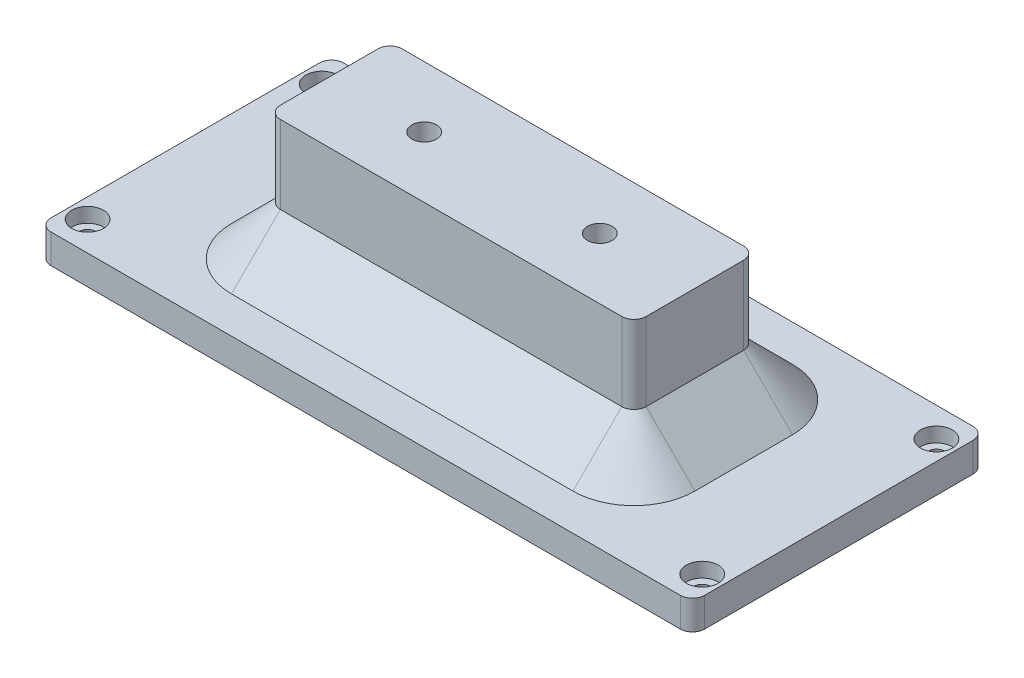
ISO-10303-21;
HEADER;
FILE_DESCRIPTION(('STEP AP214'),'2;1');
FILE_NAME('part.step','',(''),(''),'','','');
FILE_SCHEMA(('AUTOMOTIVE_DESIGN { 1 0 10303 214 1 1 1 1 }'));
ENDSEC;
DATA;
#1=APPLICATION_CONTEXT('core data for automotive mechanical design processes');
#2=APPLICATION_PROTOCOL_DEFINITION('international standard','automotive_design',2000,#1);
#3=PRODUCT_CONTEXT('',#1,'mechanical');
#4=PRODUCT('Part','Part','',(#3));
#5=PRODUCT_RELATED_PRODUCT_CATEGORY('part','',(#4));
#6=PRODUCT_DEFINITION_FORMATION('','',#4);
#7=PRODUCT_DEFINITION_CONTEXT('part definition',#1,'design');
#8=PRODUCT_DEFINITION('design','',#6,#7);
#9=PRODUCT_DEFINITION_SHAPE('','',#8);
#10=(LENGTH_UNIT() NAMED_UNIT(*) SI_UNIT(.MILLI.,.METRE.));
#11=(NAMED_UNIT(*) PLANE_ANGLE_UNIT() SI_UNIT($,.RADIAN.));
#12=(NAMED_UNIT(*) SI_UNIT($,.STERADIAN.) SOLID_ANGLE_UNIT());
#13=UNCERTAINTY_MEASURE_WITH_UNIT(LENGTH_MEASURE(1.E-05),#10,'distance_accuracy_value','');
#14=(GEOMETRIC_REPRESENTATION_CONTEXT(3) GLOBAL_UNCERTAINTY_ASSIGNED_CONTEXT((#13)) GLOBAL_UNIT_ASSIGNED_CONTEXT((#10,
#11,#12)) REPRESENTATION_CONTEXT('',''));
#15=CARTESIAN_POINT('',(0.,0.,0.));
#16=DIRECTION('',(0.,0.,1.));
#17=DIRECTION('',(1.,0.,0.));
#18=AXIS2_PLACEMENT_3D('',#15,#16,#17);
#19=CARTESIAN_POINT('',(0.,6.,0.));
#20=DIRECTION('',(0.,1.,0.));
#21=DIRECTION('',(0.,0.,1.));
#22=AXIS2_PLACEMENT_3D('',#19,#20,#21);
#23=PLANE('',#22);
#24=CARTESIAN_POINT('',(-35.,6.,-10.));
#25=DIRECTION('',(0.,1.,0.));
#26=DIRECTION('',(0.,0.,1.));
#27=AXIS2_PLACEMENT_3D('',#24,#25,#26);
#28=CIRCLE('',#27,12.5);
#29=CARTESIAN_POINT('',(-47.4999999999999,6.,-10.));
#30=VERTEX_POINT('',#29);
#31=CARTESIAN_POINT('',(-35.,6.,-22.5));
#32=VERTEX_POINT('',#31);
#33=EDGE_CURVE('E306',#30,#32,#28,.F.);
#34=ORIENTED_EDGE('',*,*,#33,.T.);
#35=DIRECTION('',(1.,0.,0.));
#36=VECTOR('',#35,1.);
#37=CARTESIAN_POINT('',(0.,6.,-22.5));
#38=LINE('',#37,#36);
#39=CARTESIAN_POINT('',(35.,6.,-22.5));
#40=VERTEX_POINT('',#39);
#41=EDGE_CURVE('E308',#32,#40,#38,.T.);
#42=ORIENTED_EDGE('',*,*,#41,.T.);
#43=CARTESIAN_POINT('',(35.,6.,-10.));
#44=DIRECTION('',(0.,1.,0.));
#45=DIRECTION('',(0.,0.,1.));
#46=AXIS2_PLACEMENT_3D('',#43,#44,#45);
#47=CIRCLE('',#46,12.5);
#48=CARTESIAN_POINT('',(47.5,6.,-10.));
#49=VERTEX_POINT('',#48);
#50=EDGE_CURVE('E304',#40,#49,#47,.F.);
#51=ORIENTED_EDGE('',*,*,#50,.T.);
#52=DIRECTION('',(0.,0.,1.));
#53=VECTOR('',#52,1.);
#54=CARTESIAN_POINT('',(47.5,6.,0.));
#55=LINE('',#54,#53);
#56=CARTESIAN_POINT('',(47.5,6.,10.));
#57=VERTEX_POINT('',#56);
#58=EDGE_CURVE('E299',#49,#57,#55,.T.);
#59=ORIENTED_EDGE('',*,*,#58,.T.);
#60=CARTESIAN_POINT('',(35.,6.,10.));
#61=DIRECTION('',(0.,1.,0.));
#62=DIRECTION('',(0.,0.,1.));
#63=AXIS2_PLACEMENT_3D('',#60,#61,#62);
#64=CIRCLE('',#63,12.5);
#65=CARTESIAN_POINT('',(35.,6.,22.5));
#66=VERTEX_POINT('',#65);
#67=EDGE_CURVE('E295',#57,#66,#64,.F.);
#68=ORIENTED_EDGE('',*,*,#67,.T.);
#69=DIRECTION('',(-1.,0.,0.));
#70=VECTOR('',#69,1.);
#71=CARTESIAN_POINT('',(0.,6.,22.5));
#72=LINE('',#71,#70);
#73=CARTESIAN_POINT('',(-35.,6.,22.5));
#74=VERTEX_POINT('',#73);
#75=EDGE_CURVE('E293',#66,#74,#72,.T.);
#76=ORIENTED_EDGE('',*,*,#75,.T.);
#77=CARTESIAN_POINT('',(-35.,6.,10.));
#78=DIRECTION('',(0.,1.,0.));
#79=DIRECTION('',(0.,0.,1.));
#80=AXIS2_PLACEMENT_3D('',#77,#78,#79);
#81=CIRCLE('',#80,12.5);
#82=CARTESIAN_POINT('',(-47.5,6.,10.));
#83=VERTEX_POINT('',#82);
#84=EDGE_CURVE('E297',#74,#83,#81,.F.);
#85=ORIENTED_EDGE('',*,*,#84,.T.);
#86=DIRECTION('',(0.,0.,-1.));
#87=VECTOR('',#86,1.);
#88=CARTESIAN_POINT('',(-47.4999999999999,6.,0.));
#89=LINE('',#88,#87);
#90=EDGE_CURVE('E301',#83,#30,#89,.T.);
#91=ORIENTED_EDGE('',*,*,#90,.T.);
#92=EDGE_LOOP('',(#34,#42,#51,#59,#68,#76,#85,#91));
#93=FACE_BOUND('',#92,.T.);
#94=CARTESIAN_POINT('',(-63.,6.,-24.));
#95=DIRECTION('',(0.,1.,0.));
#96=DIRECTION('',(0.,0.,1.));
#97=AXIS2_PLACEMENT_3D('',#94,#95,#96);
#98=CIRCLE('',#97,3.25);
#99=CARTESIAN_POINT('',(-63.,6.,-20.75));
#100=VERTEX_POINT('',#99);
#101=EDGE_CURVE('E373',#100,#100,#98,.T.);
#102=ORIENTED_EDGE('',*,*,#101,.F.);
#103=EDGE_LOOP('',(#102));
#104=FACE_BOUND('',#103,.T.);
#105=CARTESIAN_POINT('',(-63.,6.,24.));
#106=DIRECTION('',(0.,1.,0.));
#107=DIRECTION('',(0.,0.,1.));
#108=AXIS2_PLACEMENT_3D('',#105,#106,#107);
#109=CIRCLE('',#108,3.25);
#110=CARTESIAN_POINT('',(-63.,6.,27.25));
#111=VERTEX_POINT('',#110);
#112=EDGE_CURVE('E234',#111,#111,#109,.T.);
#113=ORIENTED_EDGE('',*,*,#112,.F.);
#114=EDGE_LOOP('',(#113));
#115=FACE_BOUND('',#114,.T.);
#116=CARTESIAN_POINT('',(63.,6.,24.));
#117=DIRECTION('',(0.,1.,0.));
#118=DIRECTION('',(0.,0.,1.));
#119=AXIS2_PLACEMENT_3D('',#116,#117,#118);
#120=CIRCLE('',#119,3.25);
#121=CARTESIAN_POINT('',(63.,6.,27.25));
#122=VERTEX_POINT('',#121);
#123=EDGE_CURVE('E229',#122,#122,#120,.T.);
#124=ORIENTED_EDGE('',*,*,#123,.F.);
#125=EDGE_LOOP('',(#124));
#126=FACE_BOUND('',#125,.T.);
#127=CARTESIAN_POINT('',(63.,6.,-24.));
#128=DIRECTION('',(0.,1.,0.));
#129=DIRECTION('',(0.,0.,1.));
#130=AXIS2_PLACEMENT_3D('',#127,#128,#129);
#131=CIRCLE('',#130,3.25);
#132=CARTESIAN_POINT('',(63.,6.,-20.75));
#133=VERTEX_POINT('',#132);
#134=EDGE_CURVE('E224',#133,#133,#131,.T.);
#135=ORIENTED_EDGE('',*,*,#134,.F.);
#136=EDGE_LOOP('',(#135));
#137=FACE_BOUND('',#136,.T.);
#138=DIRECTION('',(0.,0.,-1.));
#139=VECTOR('',#138,1.);
#140=CARTESIAN_POINT('',(67.,6.,-30.));
#141=LINE('',#140,#139);
#142=CARTESIAN_POINT('',(67.,6.,27.5));
#143=VERTEX_POINT('',#142);
#144=CARTESIAN_POINT('',(67.,6.,-27.5));
#145=VERTEX_POINT('',#144);
#146=EDGE_CURVE('E217',#143,#145,#141,.T.);
#147=ORIENTED_EDGE('',*,*,#146,.T.);
#148=CARTESIAN_POINT('',(64.5,6.,-27.5));
#149=DIRECTION('',(0.,1.,0.));
#150=DIRECTION('',(0.,0.,1.));
#151=AXIS2_PLACEMENT_3D('',#148,#149,#150);
#152=CIRCLE('',#151,2.5);
#153=CARTESIAN_POINT('',(64.5,6.,-30.));
#154=VERTEX_POINT('',#153);
#155=EDGE_CURVE('E251',#145,#154,#152,.T.);
#156=ORIENTED_EDGE('',*,*,#155,.T.);
#157=DIRECTION('',(-1.,0.,0.));
#158=VECTOR('',#157,1.);
#159=CARTESIAN_POINT('',(-67.,6.,-30.));
#160=LINE('',#159,#158);
#161=CARTESIAN_POINT('',(-64.5,6.,-30.));
#162=VERTEX_POINT('',#161);
#163=EDGE_CURVE('E199',#154,#162,#160,.T.);
#164=ORIENTED_EDGE('',*,*,#163,.T.);
#165=CARTESIAN_POINT('',(-64.5,6.,-27.5));
#166=DIRECTION('',(0.,1.,0.));
#167=DIRECTION('',(0.,0.,1.));
#168=AXIS2_PLACEMENT_3D('',#165,#166,#167);
#169=CIRCLE('',#168,2.5);
#170=CARTESIAN_POINT('',(-67.,6.,-27.5));
#171=VERTEX_POINT('',#170);
#172=EDGE_CURVE('E245',#162,#171,#169,.T.);
#173=ORIENTED_EDGE('',*,*,#172,.T.);
#174=DIRECTION('',(0.,0.,1.));
#175=VECTOR('',#174,1.);
#176=CARTESIAN_POINT('',(-67.,6.,-30.));
#177=LINE('',#176,#175);
#178=CARTESIAN_POINT('',(-67.,6.,27.5));
#179=VERTEX_POINT('',#178);
#180=EDGE_CURVE('E405',#171,#179,#177,.T.);
#181=ORIENTED_EDGE('',*,*,#180,.T.);
#182=CARTESIAN_POINT('',(-64.5,6.,27.5));
#183=DIRECTION('',(0.,1.,0.));
#184=DIRECTION('',(0.,0.,1.));
#185=AXIS2_PLACEMENT_3D('',#182,#183,#184);
#186=CIRCLE('',#185,2.5);
#187=CARTESIAN_POINT('',(-64.5,6.,30.));
#188=VERTEX_POINT('',#187);
#189=EDGE_CURVE('E247',#179,#188,#186,.T.);
#190=ORIENTED_EDGE('',*,*,#189,.T.);
#191=DIRECTION('',(1.,0.,0.));
#192=VECTOR('',#191,1.);
#193=CARTESIAN_POINT('',(-67.,6.,30.));
#194=LINE('',#193,#192);
#195=CARTESIAN_POINT('',(64.5,6.,30.));
#196=VERTEX_POINT('',#195);
#197=EDGE_CURVE('E236',#188,#196,#194,.T.);
#198=ORIENTED_EDGE('',*,*,#197,.T.);
#199=CARTESIAN_POINT('',(64.5,6.,27.5));
#200=DIRECTION('',(0.,1.,0.));
#201=DIRECTION('',(0.,0.,1.));
#202=AXIS2_PLACEMENT_3D('',#199,#200,#201);
#203=CIRCLE('',#202,2.5);
#204=EDGE_CURVE('E249',#196,#143,#203,.T.);
#205=ORIENTED_EDGE('',*,*,#204,.T.);
#206=EDGE_LOOP('',(#147,#156,#164,#173,#181,#190,#198,#205));
#207=FACE_BOUND('',#206,.T.);
#208=ADVANCED_FACE('F39',(#93,#104,#115,#126,#137,#207),#23,.T.);
#209=CARTESIAN_POINT('',(67.,6.,-30.));
#210=DIRECTION('',(-1.,0.,0.));
#211=DIRECTION('',(0.,0.,1.));
#212=AXIS2_PLACEMENT_3D('',#209,#210,#211);
#213=PLANE('',#212);
#214=DIRECTION('',(0.,0.,-1.));
#215=VECTOR('',#214,1.);
#216=CARTESIAN_POINT('',(67.,0.,-30.));
#217=LINE('',#216,#215);
#218=CARTESIAN_POINT('',(67.,0.,27.5));
#219=VERTEX_POINT('',#218);
#220=CARTESIAN_POINT('',(67.,0.,-27.5));
#221=VERTEX_POINT('',#220);
#222=EDGE_CURVE('E206',#219,#221,#217,.T.);
#223=ORIENTED_EDGE('',*,*,#222,.T.);
#224=DIRECTION('',(0.,-1.,0.));
#225=VECTOR('',#224,1.);
#226=CARTESIAN_POINT('',(67.,6.,-27.5));
#227=LINE('',#226,#225);
#228=EDGE_CURVE('E184',#221,#145,#227,.F.);
#229=ORIENTED_EDGE('',*,*,#228,.T.);
#230=ORIENTED_EDGE('',*,*,#146,.F.);
#231=DIRECTION('',(0.,-1.,0.));
#232=VECTOR('',#231,1.);
#233=CARTESIAN_POINT('',(67.,6.,27.5));
#234=LINE('',#233,#232);
#235=EDGE_CURVE('E189',#143,#219,#234,.T.);
#236=ORIENTED_EDGE('',*,*,#235,.T.);
#237=EDGE_LOOP('',(#223,#229,#230,#236));
#238=FACE_BOUND('',#237,.T.);
#239=ADVANCED_FACE('F420',(#238),#213,.F.);
#240=CARTESIAN_POINT('',(-67.,6.,-30.));
#241=DIRECTION('',(0.,0.,1.));
#242=DIRECTION('',(1.,0.,0.));
#243=AXIS2_PLACEMENT_3D('',#240,#241,#242);
#244=PLANE('',#243);
#245=ORIENTED_EDGE('',*,*,#163,.F.);
#246=DIRECTION('',(0.,-1.,0.));
#247=VECTOR('',#246,1.);
#248=CARTESIAN_POINT('',(64.5,6.,-30.));
#249=LINE('',#248,#247);
#250=CARTESIAN_POINT('',(64.5,0.,-30.));
#251=VERTEX_POINT('',#250);
#252=EDGE_CURVE('E183',#154,#251,#249,.T.);
#253=ORIENTED_EDGE('',*,*,#252,.T.);
#254=DIRECTION('',(-1.,0.,0.));
#255=VECTOR('',#254,1.);
#256=CARTESIAN_POINT('',(-67.,0.,-30.));
#257=LINE('',#256,#255);
#258=CARTESIAN_POINT('',(-64.5,0.,-30.));
#259=VERTEX_POINT('',#258);
#260=EDGE_CURVE('E196',#251,#259,#257,.T.);
#261=ORIENTED_EDGE('',*,*,#260,.T.);
#262=DIRECTION('',(0.,-1.,0.));
#263=VECTOR('',#262,1.);
#264=CARTESIAN_POINT('',(-64.5,6.,-30.));
#265=LINE('',#264,#263);
#266=EDGE_CURVE('E201',#259,#162,#265,.F.);
#267=ORIENTED_EDGE('',*,*,#266,.T.);
#268=EDGE_LOOP('',(#245,#253,#261,#267));
#269=FACE_BOUND('',#268,.T.);
#270=ADVANCED_FACE('F195',(#269),#244,.F.);
#271=CARTESIAN_POINT('',(-67.,6.,-30.));
#272=DIRECTION('',(1.,0.,0.));
#273=DIRECTION('',(0.,0.,-1.));
#274=AXIS2_PLACEMENT_3D('',#271,#272,#273);
#275=PLANE('',#274);
#276=DIRECTION('',(0.,0.,1.));
#277=VECTOR('',#276,1.);
#278=CARTESIAN_POINT('',(-67.,0.,-30.));
#279=LINE('',#278,#277);
#280=CARTESIAN_POINT('',(-67.,0.,-27.5));
#281=VERTEX_POINT('',#280);
#282=CARTESIAN_POINT('',(-67.,0.,27.5));
#283=VERTEX_POINT('',#282);
#284=EDGE_CURVE('E205',#281,#283,#279,.T.);
#285=ORIENTED_EDGE('',*,*,#284,.T.);
#286=DIRECTION('',(0.,-1.,0.));
#287=VECTOR('',#286,1.);
#288=CARTESIAN_POINT('',(-67.,6.,27.5));
#289=LINE('',#288,#287);
#290=EDGE_CURVE('E261',#283,#179,#289,.F.);
#291=ORIENTED_EDGE('',*,*,#290,.T.);
#292=ORIENTED_EDGE('',*,*,#180,.F.);
#293=DIRECTION('',(0.,-1.,0.));
#294=VECTOR('',#293,1.);
#295=CARTESIAN_POINT('',(-67.,6.,-27.5));
#296=LINE('',#295,#294);
#297=EDGE_CURVE('E258',#171,#281,#296,.T.);
#298=ORIENTED_EDGE('',*,*,#297,.T.);
#299=EDGE_LOOP('',(#285,#291,#292,#298));
#300=FACE_BOUND('',#299,.T.);
#301=ADVANCED_FACE('F427',(#300),#275,.F.);
#302=CARTESIAN_POINT('',(-67.,6.,30.));
#303=DIRECTION('',(0.,0.,-1.));
#304=DIRECTION('',(-1.,0.,0.));
#305=AXIS2_PLACEMENT_3D('',#302,#303,#304);
#306=PLANE('',#305);
#307=DIRECTION('',(1.,0.,0.));
#308=VECTOR('',#307,1.);
#309=CARTESIAN_POINT('',(-67.,0.,30.));
#310=LINE('',#309,#308);
#311=CARTESIAN_POINT('',(-64.5,0.,30.));
#312=VERTEX_POINT('',#311);
#313=CARTESIAN_POINT('',(64.5,0.,30.));
#314=VERTEX_POINT('',#313);
#315=EDGE_CURVE('E209',#312,#314,#310,.T.);
#316=ORIENTED_EDGE('',*,*,#315,.T.);
#317=DIRECTION('',(0.,-1.,0.));
#318=VECTOR('',#317,1.);
#319=CARTESIAN_POINT('',(64.5,6.,30.));
#320=LINE('',#319,#318);
#321=EDGE_CURVE('E256',#314,#196,#320,.F.);
#322=ORIENTED_EDGE('',*,*,#321,.T.);
#323=ORIENTED_EDGE('',*,*,#197,.F.);
#324=DIRECTION('',(0.,-1.,0.));
#325=VECTOR('',#324,1.);
#326=CARTESIAN_POINT('',(-64.5,6.,30.));
#327=LINE('',#326,#325);
#328=EDGE_CURVE('E253',#188,#312,#327,.T.);
#329=ORIENTED_EDGE('',*,*,#328,.T.);
#330=EDGE_LOOP('',(#316,#322,#323,#329));
#331=FACE_BOUND('',#330,.T.);
#332=ADVANCED_FACE('F422',(#331),#306,.F.);
#333=CARTESIAN_POINT('',(0.,0.,0.));
#334=DIRECTION('',(0.,1.,0.));
#335=DIRECTION('',(0.,0.,1.));
#336=AXIS2_PLACEMENT_3D('',#333,#334,#335);
#337=PLANE('',#336);
#338=CARTESIAN_POINT('',(-18.,0.,0.));
#339=DIRECTION('',(0.,1.,0.));
#340=DIRECTION('',(0.,0.,1.));
#341=AXIS2_PLACEMENT_3D('',#338,#339,#340);
#342=CIRCLE('',#341,2.52729999999999);
#343=CARTESIAN_POINT('',(-18.,0.,2.5273));
#344=VERTEX_POINT('',#343);
#345=EDGE_CURVE('E348',#344,#344,#342,.T.);
#346=ORIENTED_EDGE('',*,*,#345,.T.);
#347=EDGE_LOOP('',(#346));
#348=FACE_BOUND('',#347,.T.);
#349=CARTESIAN_POINT('',(18.,0.,0.));
#350=DIRECTION('',(0.,1.,0.));
#351=DIRECTION('',(0.,0.,1.));
#352=AXIS2_PLACEMENT_3D('',#349,#350,#351);
#353=CIRCLE('',#352,2.52729999999999);
#354=CARTESIAN_POINT('',(18.,0.,2.52729999999998));
#355=VERTEX_POINT('',#354);
#356=EDGE_CURVE('E358',#355,#355,#353,.T.);
#357=ORIENTED_EDGE('',*,*,#356,.T.);
#358=EDGE_LOOP('',(#357));
#359=FACE_BOUND('',#358,.T.);
#360=CARTESIAN_POINT('',(-63.,0.,-24.));
#361=DIRECTION('',(0.,1.,0.));
#362=DIRECTION('',(0.,0.,1.));
#363=AXIS2_PLACEMENT_3D('',#360,#361,#362);
#364=CIRCLE('',#363,1.7);
#365=CARTESIAN_POINT('',(-63.,0.,-22.3));
#366=VERTEX_POINT('',#365);
#367=EDGE_CURVE('E231',#366,#366,#364,.T.);
#368=ORIENTED_EDGE('',*,*,#367,.T.);
#369=EDGE_LOOP('',(#368));
#370=FACE_BOUND('',#369,.T.);
#371=CARTESIAN_POINT('',(-63.,0.,24.));
#372=DIRECTION('',(0.,1.,0.));
#373=DIRECTION('',(0.,0.,1.));
#374=AXIS2_PLACEMENT_3D('',#371,#372,#373);
#375=CIRCLE('',#374,1.7);
#376=CARTESIAN_POINT('',(-63.,0.,25.7));
#377=VERTEX_POINT('',#376);
#378=EDGE_CURVE('E226',#377,#377,#375,.T.);
#379=ORIENTED_EDGE('',*,*,#378,.T.);
#380=EDGE_LOOP('',(#379));
#381=FACE_BOUND('',#380,.T.);
#382=CARTESIAN_POINT('',(63.,0.,24.));
#383=DIRECTION('',(0.,1.,0.));
#384=DIRECTION('',(0.,0.,1.));
#385=AXIS2_PLACEMENT_3D('',#382,#383,#384);
#386=CIRCLE('',#385,1.69999999999999);
#387=CARTESIAN_POINT('',(63.,0.,25.7));
#388=VERTEX_POINT('',#387);
#389=EDGE_CURVE('E221',#388,#388,#386,.T.);
#390=ORIENTED_EDGE('',*,*,#389,.T.);
#391=EDGE_LOOP('',(#390));
#392=FACE_BOUND('',#391,.T.);
#393=CARTESIAN_POINT('',(63.,0.,-24.));
#394=DIRECTION('',(0.,1.,0.));
#395=DIRECTION('',(0.,0.,1.));
#396=AXIS2_PLACEMENT_3D('',#393,#394,#395);
#397=CIRCLE('',#396,1.69999999999999);
#398=CARTESIAN_POINT('',(63.,0.,-22.3));
#399=VERTEX_POINT('',#398);
#400=EDGE_CURVE('E211',#399,#399,#397,.T.);
#401=ORIENTED_EDGE('',*,*,#400,.T.);
#402=EDGE_LOOP('',(#401));
#403=FACE_BOUND('',#402,.T.);
#404=ORIENTED_EDGE('',*,*,#260,.F.);
#405=CARTESIAN_POINT('',(64.5,0.,-27.5));
#406=DIRECTION('',(0.,1.,0.));
#407=DIRECTION('',(0.,0.,1.));
#408=AXIS2_PLACEMENT_3D('',#405,#406,#407);
#409=CIRCLE('',#408,2.5);
#410=EDGE_CURVE('E179',#251,#221,#409,.F.);
#411=ORIENTED_EDGE('',*,*,#410,.T.);
#412=ORIENTED_EDGE('',*,*,#222,.F.);
#413=CARTESIAN_POINT('',(64.5,0.,27.5));
#414=DIRECTION('',(0.,1.,0.));
#415=DIRECTION('',(0.,0.,1.));
#416=AXIS2_PLACEMENT_3D('',#413,#414,#415);
#417=CIRCLE('',#416,2.5);
#418=EDGE_CURVE('E190',#219,#314,#417,.F.);
#419=ORIENTED_EDGE('',*,*,#418,.T.);
#420=ORIENTED_EDGE('',*,*,#315,.F.);
#421=CARTESIAN_POINT('',(-64.5,0.,27.5));
#422=DIRECTION('',(0.,1.,0.));
#423=DIRECTION('',(0.,0.,1.));
#424=AXIS2_PLACEMENT_3D('',#421,#422,#423);
#425=CIRCLE('',#424,2.5);
#426=EDGE_CURVE('E239',#312,#283,#425,.F.);
#427=ORIENTED_EDGE('',*,*,#426,.T.);
#428=ORIENTED_EDGE('',*,*,#284,.F.);
#429=CARTESIAN_POINT('',(-64.5,0.,-27.5));
#430=DIRECTION('',(0.,1.,0.));
#431=DIRECTION('',(0.,0.,1.));
#432=AXIS2_PLACEMENT_3D('',#429,#430,#431);
#433=CIRCLE('',#432,2.5);
#434=EDGE_CURVE('E200',#281,#259,#433,.F.);
#435=ORIENTED_EDGE('',*,*,#434,.T.);
#436=EDGE_LOOP('',(#404,#411,#412,#419,#420,#427,#428,#435));
#437=FACE_BOUND('',#436,.T.);
#438=ADVANCED_FACE('F203',(#348,#359,#370,#381,#392,#403,#437),#337,.F.);
#439=CARTESIAN_POINT('',(63.,6.,-24.));
#440=DIRECTION('',(0.,1.,0.));
#441=DIRECTION('',(0.,0.,1.));
#442=AXIS2_PLACEMENT_3D('',#439,#440,#441);
#443=CYLINDRICAL_SURFACE('',#442,1.69999999999999);
#444=CARTESIAN_POINT('',(63.,3.,-24.));
#445=DIRECTION('',(0.,1.,0.));
#446=DIRECTION('',(0.,0.,1.));
#447=AXIS2_PLACEMENT_3D('',#444,#445,#446);
#448=CIRCLE('',#447,1.69999999999999);
#449=CARTESIAN_POINT('',(63.,3.,-22.3));
#450=VERTEX_POINT('',#449);
#451=EDGE_CURVE('E220',#450,#450,#448,.T.);
#452=ORIENTED_EDGE('',*,*,#451,.T.);
#453=EDGE_LOOP('',(#452));
#454=FACE_BOUND('',#453,.T.);
#455=ORIENTED_EDGE('',*,*,#400,.F.);
#456=EDGE_LOOP('',(#455));
#457=FACE_BOUND('',#456,.T.);
#458=ADVANCED_FACE('F454',(#454,#457),#443,.F.);
#459=CARTESIAN_POINT('',(64.7,3.,-24.));
#460=DIRECTION('',(0.,-1.,0.));
#461=DIRECTION('',(0.,0.,-1.));
#462=AXIS2_PLACEMENT_3D('',#459,#460,#461);
#463=PLANE('',#462);
#464=ORIENTED_EDGE('',*,*,#451,.F.);
#465=EDGE_LOOP('',(#464));
#466=FACE_BOUND('',#465,.T.);
#467=CARTESIAN_POINT('',(63.,3.,-24.));
#468=DIRECTION('',(0.,1.,0.));
#469=DIRECTION('',(0.,0.,1.));
#470=AXIS2_PLACEMENT_3D('',#467,#468,#469);
#471=CIRCLE('',#470,3.25);
#472=CARTESIAN_POINT('',(63.,3.,-20.75));
#473=VERTEX_POINT('',#472);
#474=EDGE_CURVE('E397',#473,#473,#471,.T.);
#475=ORIENTED_EDGE('',*,*,#474,.T.);
#476=EDGE_LOOP('',(#475));
#477=FACE_BOUND('',#476,.T.);
#478=ADVANCED_FACE('F765',(#466,#477),#463,.F.);
#479=CARTESIAN_POINT('',(63.,6.,-24.));
#480=DIRECTION('',(0.,1.,0.));
#481=DIRECTION('',(0.,0.,1.));
#482=AXIS2_PLACEMENT_3D('',#479,#480,#481);
#483=CYLINDRICAL_SURFACE('',#482,3.25);
#484=ORIENTED_EDGE('',*,*,#474,.F.);
#485=EDGE_LOOP('',(#484));
#486=FACE_BOUND('',#485,.T.);
#487=ORIENTED_EDGE('',*,*,#134,.T.);
#488=EDGE_LOOP('',(#487));
#489=FACE_BOUND('',#488,.T.);
#490=ADVANCED_FACE('F771',(#486,#489),#483,.F.);
#491=CARTESIAN_POINT('',(63.,6.,24.));
#492=DIRECTION('',(0.,1.,0.));
#493=DIRECTION('',(0.,0.,1.));
#494=AXIS2_PLACEMENT_3D('',#491,#492,#493);
#495=CYLINDRICAL_SURFACE('',#494,1.69999999999999);
#496=CARTESIAN_POINT('',(63.,3.,24.));
#497=DIRECTION('',(0.,1.,0.));
#498=DIRECTION('',(0.,0.,1.));
#499=AXIS2_PLACEMENT_3D('',#496,#497,#498);
#500=CIRCLE('',#499,1.69999999999999);
#501=CARTESIAN_POINT('',(63.,3.,25.7));
#502=VERTEX_POINT('',#501);
#503=EDGE_CURVE('E225',#502,#502,#500,.T.);
#504=ORIENTED_EDGE('',*,*,#503,.T.);
#505=EDGE_LOOP('',(#504));
#506=FACE_BOUND('',#505,.T.);
#507=ORIENTED_EDGE('',*,*,#389,.F.);
#508=EDGE_LOOP('',(#507));
#509=FACE_BOUND('',#508,.T.);
#510=ADVANCED_FACE('F778',(#506,#509),#495,.F.);
#511=CARTESIAN_POINT('',(64.7,3.,24.));
#512=DIRECTION('',(0.,-1.,0.));
#513=DIRECTION('',(0.,0.,-1.));
#514=AXIS2_PLACEMENT_3D('',#511,#512,#513);
#515=PLANE('',#514);
#516=ORIENTED_EDGE('',*,*,#503,.F.);
#517=EDGE_LOOP('',(#516));
#518=FACE_BOUND('',#517,.T.);
#519=CARTESIAN_POINT('',(63.,3.,24.));
#520=DIRECTION('',(0.,1.,0.));
#521=DIRECTION('',(0.,0.,1.));
#522=AXIS2_PLACEMENT_3D('',#519,#520,#521);
#523=CIRCLE('',#522,3.25);
#524=CARTESIAN_POINT('',(63.,3.,27.25));
#525=VERTEX_POINT('',#524);
#526=EDGE_CURVE('E390',#525,#525,#523,.T.);
#527=ORIENTED_EDGE('',*,*,#526,.T.);
#528=EDGE_LOOP('',(#527));
#529=FACE_BOUND('',#528,.T.);
#530=ADVANCED_FACE('F786',(#518,#529),#515,.F.);
#531=CARTESIAN_POINT('',(63.,6.,24.));
#532=DIRECTION('',(0.,1.,0.));
#533=DIRECTION('',(0.,0.,1.));
#534=AXIS2_PLACEMENT_3D('',#531,#532,#533);
#535=CYLINDRICAL_SURFACE('',#534,3.25);
#536=ORIENTED_EDGE('',*,*,#526,.F.);
#537=EDGE_LOOP('',(#536));
#538=FACE_BOUND('',#537,.T.);
#539=ORIENTED_EDGE('',*,*,#123,.T.);
#540=EDGE_LOOP('',(#539));
#541=FACE_BOUND('',#540,.T.);
#542=ADVANCED_FACE('F794',(#538,#541),#535,.F.);
#543=CARTESIAN_POINT('',(-63.,6.,24.));
#544=DIRECTION('',(0.,1.,0.));
#545=DIRECTION('',(0.,0.,1.));
#546=AXIS2_PLACEMENT_3D('',#543,#544,#545);
#547=CYLINDRICAL_SURFACE('',#546,1.7);
#548=CARTESIAN_POINT('',(-63.,3.,24.));
#549=DIRECTION('',(0.,1.,0.));
#550=DIRECTION('',(0.,0.,1.));
#551=AXIS2_PLACEMENT_3D('',#548,#549,#550);
#552=CIRCLE('',#551,1.7);
#553=CARTESIAN_POINT('',(-63.,3.,25.7));
#554=VERTEX_POINT('',#553);
#555=EDGE_CURVE('E230',#554,#554,#552,.T.);
#556=ORIENTED_EDGE('',*,*,#555,.T.);
#557=EDGE_LOOP('',(#556));
#558=FACE_BOUND('',#557,.T.);
#559=ORIENTED_EDGE('',*,*,#378,.F.);
#560=EDGE_LOOP('',(#559));
#561=FACE_BOUND('',#560,.T.);
#562=ADVANCED_FACE('F802',(#558,#561),#547,.F.);
#563=CARTESIAN_POINT('',(-61.3,3.,24.));
#564=DIRECTION('',(0.,-1.,0.));
#565=DIRECTION('',(0.,0.,-1.));
#566=AXIS2_PLACEMENT_3D('',#563,#564,#565);
#567=PLANE('',#566);
#568=ORIENTED_EDGE('',*,*,#555,.F.);
#569=EDGE_LOOP('',(#568));
#570=FACE_BOUND('',#569,.T.);
#571=CARTESIAN_POINT('',(-63.,3.,24.));
#572=DIRECTION('',(0.,1.,0.));
#573=DIRECTION('',(0.,0.,1.));
#574=AXIS2_PLACEMENT_3D('',#571,#572,#573);
#575=CIRCLE('',#574,3.25);
#576=CARTESIAN_POINT('',(-63.,3.,27.25));
#577=VERTEX_POINT('',#576);
#578=EDGE_CURVE('E383',#577,#577,#575,.T.);
#579=ORIENTED_EDGE('',*,*,#578,.T.);
#580=EDGE_LOOP('',(#579));
#581=FACE_BOUND('',#580,.T.);
#582=ADVANCED_FACE('F810',(#570,#581),#567,.F.);
#583=CARTESIAN_POINT('',(-63.,6.,24.));
#584=DIRECTION('',(0.,1.,0.));
#585=DIRECTION('',(0.,0.,1.));
#586=AXIS2_PLACEMENT_3D('',#583,#584,#585);
#587=CYLINDRICAL_SURFACE('',#586,3.25);
#588=ORIENTED_EDGE('',*,*,#578,.F.);
#589=EDGE_LOOP('',(#588));
#590=FACE_BOUND('',#589,.T.);
#591=ORIENTED_EDGE('',*,*,#112,.T.);
#592=EDGE_LOOP('',(#591));
#593=FACE_BOUND('',#592,.T.);
#594=ADVANCED_FACE('F818',(#590,#593),#587,.F.);
#595=CARTESIAN_POINT('',(-63.,6.,-24.));
#596=DIRECTION('',(0.,1.,0.));
#597=DIRECTION('',(0.,0.,1.));
#598=AXIS2_PLACEMENT_3D('',#595,#596,#597);
#599=CYLINDRICAL_SURFACE('',#598,1.7);
#600=CARTESIAN_POINT('',(-63.,3.,-24.));
#601=DIRECTION('',(0.,1.,0.));
#602=DIRECTION('',(0.,0.,1.));
#603=AXIS2_PLACEMENT_3D('',#600,#601,#602);
#604=CIRCLE('',#603,1.7);
#605=CARTESIAN_POINT('',(-63.,3.,-22.3));
#606=VERTEX_POINT('',#605);
#607=EDGE_CURVE('E235',#606,#606,#604,.T.);
#608=ORIENTED_EDGE('',*,*,#607,.T.);
#609=EDGE_LOOP('',(#608));
#610=FACE_BOUND('',#609,.T.);
#611=ORIENTED_EDGE('',*,*,#367,.F.);
#612=EDGE_LOOP('',(#611));
#613=FACE_BOUND('',#612,.T.);
#614=ADVANCED_FACE('F826',(#610,#613),#599,.F.);
#615=CARTESIAN_POINT('',(-61.3,3.,-24.));
#616=DIRECTION('',(0.,-1.,0.));
#617=DIRECTION('',(0.,0.,-1.));
#618=AXIS2_PLACEMENT_3D('',#615,#616,#617);
#619=PLANE('',#618);
#620=ORIENTED_EDGE('',*,*,#607,.F.);
#621=EDGE_LOOP('',(#620));
#622=FACE_BOUND('',#621,.T.);
#623=CARTESIAN_POINT('',(-63.,3.,-24.));
#624=DIRECTION('',(0.,1.,0.));
#625=DIRECTION('',(0.,0.,1.));
#626=AXIS2_PLACEMENT_3D('',#623,#624,#625);
#627=CIRCLE('',#626,3.25);
#628=CARTESIAN_POINT('',(-63.,3.,-20.75));
#629=VERTEX_POINT('',#628);
#630=EDGE_CURVE('E376',#629,#629,#627,.T.);
#631=ORIENTED_EDGE('',*,*,#630,.T.);
#632=EDGE_LOOP('',(#631));
#633=FACE_BOUND('',#632,.T.);
#634=ADVANCED_FACE('F834',(#622,#633),#619,.F.);
#635=CARTESIAN_POINT('',(-63.,6.,-24.));
#636=DIRECTION('',(0.,1.,0.));
#637=DIRECTION('',(0.,0.,1.));
#638=AXIS2_PLACEMENT_3D('',#635,#636,#637);
#639=CYLINDRICAL_SURFACE('',#638,3.25);
#640=ORIENTED_EDGE('',*,*,#630,.F.);
#641=EDGE_LOOP('',(#640));
#642=FACE_BOUND('',#641,.T.);
#643=ORIENTED_EDGE('',*,*,#101,.T.);
#644=EDGE_LOOP('',(#643));
#645=FACE_BOUND('',#644,.T.);
#646=ADVANCED_FACE('F519',(#642,#645),#639,.F.);
#647=CARTESIAN_POINT('',(37.5,32.,-12.5));
#648=DIRECTION('',(-1.,0.,0.));
#649=DIRECTION('',(0.,0.,1.));
#650=AXIS2_PLACEMENT_3D('',#647,#648,#649);
#651=PLANE('',#650);
#652=DIRECTION('',(0.,-1.,0.));
#653=VECTOR('',#652,1.);
#654=CARTESIAN_POINT('',(37.5,32.,10.));
#655=LINE('',#654,#653);
#656=CARTESIAN_POINT('',(37.5,32.,10.));
#657=VERTEX_POINT('',#656);
#658=CARTESIAN_POINT('',(37.5,16.0000000000001,10.));
#659=VERTEX_POINT('',#658);
#660=EDGE_CURVE('E268',#657,#659,#655,.T.);
#661=ORIENTED_EDGE('',*,*,#660,.T.);
#662=DIRECTION('',(0.,0.,-1.));
#663=VECTOR('',#662,1.);
#664=CARTESIAN_POINT('',(37.5,16.0000000000001,-12.5));
#665=LINE('',#664,#663);
#666=CARTESIAN_POINT('',(37.5,16.0000000000001,-10.));
#667=VERTEX_POINT('',#666);
#668=EDGE_CURVE('E312',#659,#667,#665,.T.);
#669=ORIENTED_EDGE('',*,*,#668,.T.);
#670=DIRECTION('',(0.,-1.,0.));
#671=VECTOR('',#670,1.);
#672=CARTESIAN_POINT('',(37.5,32.,-10.));
#673=LINE('',#672,#671);
#674=CARTESIAN_POINT('',(37.5,32.,-10.));
#675=VERTEX_POINT('',#674);
#676=EDGE_CURVE('E271',#667,#675,#673,.F.);
#677=ORIENTED_EDGE('',*,*,#676,.T.);
#678=DIRECTION('',(0.,0.,-1.));
#679=VECTOR('',#678,1.);
#680=CARTESIAN_POINT('',(37.5,32.,-12.5));
#681=LINE('',#680,#679);
#682=EDGE_CURVE('E361',#657,#675,#681,.T.);
#683=ORIENTED_EDGE('',*,*,#682,.F.);
#684=EDGE_LOOP('',(#661,#669,#677,#683));
#685=FACE_BOUND('',#684,.T.);
#686=ADVANCED_FACE('F513',(#685),#651,.F.);
#687=CARTESIAN_POINT('',(-37.5,32.,-12.5));
#688=DIRECTION('',(0.,0.,1.));
#689=DIRECTION('',(1.,0.,0.));
#690=AXIS2_PLACEMENT_3D('',#687,#688,#689);
#691=PLANE('',#690);
#692=DIRECTION('',(0.,-1.,0.));
#693=VECTOR('',#692,1.);
#694=CARTESIAN_POINT('',(35.,32.,-12.5));
#695=LINE('',#694,#693);
#696=CARTESIAN_POINT('',(35.,32.,-12.5));
#697=VERTEX_POINT('',#696);
#698=CARTESIAN_POINT('',(35.,16.0000000000001,-12.5));
#699=VERTEX_POINT('',#698);
#700=EDGE_CURVE('E265',#697,#699,#695,.T.);
#701=ORIENTED_EDGE('',*,*,#700,.T.);
#702=DIRECTION('',(-1.,0.,0.));
#703=VECTOR('',#702,1.);
#704=CARTESIAN_POINT('',(-37.5,16.0000000000001,-12.5));
#705=LINE('',#704,#703);
#706=CARTESIAN_POINT('',(-35.,16.0000000000001,-12.5));
#707=VERTEX_POINT('',#706);
#708=EDGE_CURVE('E310',#699,#707,#705,.T.);
#709=ORIENTED_EDGE('',*,*,#708,.T.);
#710=DIRECTION('',(0.,-1.,0.));
#711=VECTOR('',#710,1.);
#712=CARTESIAN_POINT('',(-35.,32.,-12.5));
#713=LINE('',#712,#711);
#714=CARTESIAN_POINT('',(-35.,32.,-12.5));
#715=VERTEX_POINT('',#714);
#716=EDGE_CURVE('E263',#707,#715,#713,.F.);
#717=ORIENTED_EDGE('',*,*,#716,.T.);
#718=DIRECTION('',(-1.,0.,0.));
#719=VECTOR('',#718,1.);
#720=CARTESIAN_POINT('',(-37.5,32.,-12.5));
#721=LINE('',#720,#719);
#722=EDGE_CURVE('E364',#697,#715,#721,.T.);
#723=ORIENTED_EDGE('',*,*,#722,.F.);
#724=EDGE_LOOP('',(#701,#709,#717,#723));
#725=FACE_BOUND('',#724,.T.);
#726=ADVANCED_FACE('F518',(#725),#691,.F.);
#727=CARTESIAN_POINT('',(-37.5,32.,-12.5));
#728=DIRECTION('',(1.,0.,0.));
#729=DIRECTION('',(0.,0.,-1.));
#730=AXIS2_PLACEMENT_3D('',#727,#728,#729);
#731=PLANE('',#730);
#732=DIRECTION('',(0.,-1.,0.));
#733=VECTOR('',#732,1.);
#734=CARTESIAN_POINT('',(-37.5,32.,-10.));
#735=LINE('',#734,#733);
#736=CARTESIAN_POINT('',(-37.5,32.,-10.));
#737=VERTEX_POINT('',#736);
#738=CARTESIAN_POINT('',(-37.5,16.0000000000001,-10.));
#739=VERTEX_POINT('',#738);
#740=EDGE_CURVE('E285',#737,#739,#735,.T.);
#741=ORIENTED_EDGE('',*,*,#740,.T.);
#742=DIRECTION('',(0.,0.,1.));
#743=VECTOR('',#742,1.);
#744=CARTESIAN_POINT('',(-37.5,16.,-12.5));
#745=LINE('',#744,#743);
#746=CARTESIAN_POINT('',(-37.5,16.0000000000001,10.));
#747=VERTEX_POINT('',#746);
#748=EDGE_CURVE('E290',#739,#747,#745,.T.);
#749=ORIENTED_EDGE('',*,*,#748,.T.);
#750=DIRECTION('',(0.,-1.,0.));
#751=VECTOR('',#750,1.);
#752=CARTESIAN_POINT('',(-37.5,32.,10.));
#753=LINE('',#752,#751);
#754=CARTESIAN_POINT('',(-37.5,32.,10.));
#755=VERTEX_POINT('',#754);
#756=EDGE_CURVE('E288',#747,#755,#753,.F.);
#757=ORIENTED_EDGE('',*,*,#756,.T.);
#758=DIRECTION('',(0.,0.,1.));
#759=VECTOR('',#758,1.);
#760=CARTESIAN_POINT('',(-37.5,32.,-12.5));
#761=LINE('',#760,#759);
#762=EDGE_CURVE('E367',#737,#755,#761,.T.);
#763=ORIENTED_EDGE('',*,*,#762,.F.);
#764=EDGE_LOOP('',(#741,#749,#757,#763));
#765=FACE_BOUND('',#764,.T.);
#766=ADVANCED_FACE('F530',(#765),#731,.F.);
#767=CARTESIAN_POINT('',(-37.5,32.,12.5));
#768=DIRECTION('',(0.,0.,-1.));
#769=DIRECTION('',(-1.,0.,0.));
#770=AXIS2_PLACEMENT_3D('',#767,#768,#769);
#771=PLANE('',#770);
#772=DIRECTION('',(0.,-1.,0.));
#773=VECTOR('',#772,1.);
#774=CARTESIAN_POINT('',(-35.,32.,12.5));
#775=LINE('',#774,#773);
#776=CARTESIAN_POINT('',(-35.,32.,12.5));
#777=VERTEX_POINT('',#776);
#778=CARTESIAN_POINT('',(-35.,16.0000000000001,12.5));
#779=VERTEX_POINT('',#778);
#780=EDGE_CURVE('E281',#777,#779,#775,.T.);
#781=ORIENTED_EDGE('',*,*,#780,.T.);
#782=DIRECTION('',(1.,0.,0.));
#783=VECTOR('',#782,1.);
#784=CARTESIAN_POINT('',(-37.5,16.0000000000001,12.5));
#785=LINE('',#784,#783);
#786=CARTESIAN_POINT('',(35.,16.0000000000001,12.5));
#787=VERTEX_POINT('',#786);
#788=EDGE_CURVE('E11',#779,#787,#785,.T.);
#789=ORIENTED_EDGE('',*,*,#788,.T.);
#790=DIRECTION('',(0.,-1.,0.));
#791=VECTOR('',#790,1.);
#792=CARTESIAN_POINT('',(35.,32.,12.5));
#793=LINE('',#792,#791);
#794=CARTESIAN_POINT('',(35.,32.,12.5));
#795=VERTEX_POINT('',#794);
#796=EDGE_CURVE('E283',#787,#795,#793,.F.);
#797=ORIENTED_EDGE('',*,*,#796,.T.);
#798=DIRECTION('',(1.,0.,0.));
#799=VECTOR('',#798,1.);
#800=CARTESIAN_POINT('',(-37.5,32.,12.5));
#801=LINE('',#800,#799);
#802=EDGE_CURVE('E370',#777,#795,#801,.T.);
#803=ORIENTED_EDGE('',*,*,#802,.F.);
#804=EDGE_LOOP('',(#781,#789,#797,#803));
#805=FACE_BOUND('',#804,.T.);
#806=ADVANCED_FACE('F495',(#805),#771,.F.);
#807=CARTESIAN_POINT('',(0.,32.,0.));
#808=DIRECTION('',(0.,1.,0.));
#809=DIRECTION('',(0.,0.,1.));
#810=AXIS2_PLACEMENT_3D('',#807,#808,#809);
#811=PLANE('',#810);
#812=CARTESIAN_POINT('',(-18.,32.,0.));
#813=DIRECTION('',(0.,1.,0.));
#814=DIRECTION('',(0.,0.,1.));
#815=AXIS2_PLACEMENT_3D('',#812,#813,#814);
#816=CIRCLE('',#815,2.52729999999999);
#817=CARTESIAN_POINT('',(-18.,32.,2.52729999999999));
#818=VERTEX_POINT('',#817);
#819=EDGE_CURVE('E342',#818,#818,#816,.T.);
#820=ORIENTED_EDGE('',*,*,#819,.F.);
#821=EDGE_LOOP('',(#820));
#822=FACE_BOUND('',#821,.T.);
#823=CARTESIAN_POINT('',(18.,32.,0.));
#824=DIRECTION('',(0.,1.,0.));
#825=DIRECTION('',(0.,0.,1.));
#826=AXIS2_PLACEMENT_3D('',#823,#824,#825);
#827=CIRCLE('',#826,2.52729999999999);
#828=CARTESIAN_POINT('',(18.,32.,2.52729999999998));
#829=VERTEX_POINT('',#828);
#830=EDGE_CURVE('E353',#829,#829,#827,.T.);
#831=ORIENTED_EDGE('',*,*,#830,.F.);
#832=EDGE_LOOP('',(#831));
#833=FACE_BOUND('',#832,.T.);
#834=ORIENTED_EDGE('',*,*,#682,.T.);
#835=CARTESIAN_POINT('',(35.,32.,-10.));
#836=DIRECTION('',(0.,1.,0.));
#837=DIRECTION('',(0.,0.,1.));
#838=AXIS2_PLACEMENT_3D('',#835,#836,#837);
#839=CIRCLE('',#838,2.5);
#840=EDGE_CURVE('E279',#675,#697,#839,.T.);
#841=ORIENTED_EDGE('',*,*,#840,.T.);
#842=ORIENTED_EDGE('',*,*,#722,.T.);
#843=CARTESIAN_POINT('',(-35.,32.,-10.));
#844=DIRECTION('',(0.,1.,0.));
#845=DIRECTION('',(0.,0.,1.));
#846=AXIS2_PLACEMENT_3D('',#843,#844,#845);
#847=CIRCLE('',#846,2.5);
#848=EDGE_CURVE('E273',#715,#737,#847,.T.);
#849=ORIENTED_EDGE('',*,*,#848,.T.);
#850=ORIENTED_EDGE('',*,*,#762,.T.);
#851=CARTESIAN_POINT('',(-35.,32.,10.));
#852=DIRECTION('',(0.,1.,0.));
#853=DIRECTION('',(0.,0.,1.));
#854=AXIS2_PLACEMENT_3D('',#851,#852,#853);
#855=CIRCLE('',#854,2.5);
#856=EDGE_CURVE('E275',#755,#777,#855,.T.);
#857=ORIENTED_EDGE('',*,*,#856,.T.);
#858=ORIENTED_EDGE('',*,*,#802,.T.);
#859=CARTESIAN_POINT('',(35.,32.,10.));
#860=DIRECTION('',(0.,1.,0.));
#861=DIRECTION('',(0.,0.,1.));
#862=AXIS2_PLACEMENT_3D('',#859,#860,#861);
#863=CIRCLE('',#862,2.5);
#864=EDGE_CURVE('E277',#795,#657,#863,.T.);
#865=ORIENTED_EDGE('',*,*,#864,.T.);
#866=EDGE_LOOP('',(#834,#841,#842,#849,#850,#857,#858,#865));
#867=FACE_BOUND('',#866,.T.);
#868=ADVANCED_FACE('F490',(#822,#833,#867),#811,.T.);
#869=CARTESIAN_POINT('',(18.,32.,0.));
#870=DIRECTION('',(0.,1.,0.));
#871=DIRECTION('',(0.,0.,1.));
#872=AXIS2_PLACEMENT_3D('',#869,#870,#871);
#873=CYLINDRICAL_SURFACE('',#872,2.52729999999999);
#874=ORIENTED_EDGE('',*,*,#356,.F.);
#875=EDGE_LOOP('',(#874));
#876=FACE_BOUND('',#875,.T.);
#877=ORIENTED_EDGE('',*,*,#830,.T.);
#878=EDGE_LOOP('',(#877));
#879=FACE_BOUND('',#878,.T.);
#880=ADVANCED_FACE('F494',(#876,#879),#873,.F.);
#881=CARTESIAN_POINT('',(-18.,32.,0.));
#882=DIRECTION('',(0.,1.,0.));
#883=DIRECTION('',(0.,0.,1.));
#884=AXIS2_PLACEMENT_3D('',#881,#882,#883);
#885=CYLINDRICAL_SURFACE('',#884,2.52729999999999);
#886=ORIENTED_EDGE('',*,*,#345,.F.);
#887=EDGE_LOOP('',(#886));
#888=FACE_BOUND('',#887,.T.);
#889=ORIENTED_EDGE('',*,*,#819,.T.);
#890=EDGE_LOOP('',(#889));
#891=FACE_BOUND('',#890,.T.);
#892=ADVANCED_FACE('F467',(#888,#891),#885,.F.);
#893=CARTESIAN_POINT('',(64.5,6.,-27.5));
#894=DIRECTION('',(0.,-1.,0.));
#895=DIRECTION('',(0.,0.,-1.));
#896=AXIS2_PLACEMENT_3D('',#893,#894,#895);
#897=CYLINDRICAL_SURFACE('',#896,2.5);
#898=ORIENTED_EDGE('',*,*,#155,.F.);
#899=ORIENTED_EDGE('',*,*,#228,.F.);
#900=ORIENTED_EDGE('',*,*,#410,.F.);
#901=ORIENTED_EDGE('',*,*,#252,.F.);
#902=EDGE_LOOP('',(#898,#899,#900,#901));
#903=FACE_BOUND('',#902,.T.);
#904=ADVANCED_FACE('F182',(#903),#897,.T.);
#905=CARTESIAN_POINT('',(64.5,6.,27.5));
#906=DIRECTION('',(0.,-1.,0.));
#907=DIRECTION('',(0.,0.,-1.));
#908=AXIS2_PLACEMENT_3D('',#905,#906,#907);
#909=CYLINDRICAL_SURFACE('',#908,2.5);
#910=ORIENTED_EDGE('',*,*,#204,.F.);
#911=ORIENTED_EDGE('',*,*,#321,.F.);
#912=ORIENTED_EDGE('',*,*,#418,.F.);
#913=ORIENTED_EDGE('',*,*,#235,.F.);
#914=EDGE_LOOP('',(#910,#911,#912,#913));
#915=FACE_BOUND('',#914,.T.);
#916=ADVANCED_FACE('F418',(#915),#909,.T.);
#917=CARTESIAN_POINT('',(-64.5,6.,27.5));
#918=DIRECTION('',(0.,-1.,0.));
#919=DIRECTION('',(0.,0.,-1.));
#920=AXIS2_PLACEMENT_3D('',#917,#918,#919);
#921=CYLINDRICAL_SURFACE('',#920,2.5);
#922=ORIENTED_EDGE('',*,*,#189,.F.);
#923=ORIENTED_EDGE('',*,*,#290,.F.);
#924=ORIENTED_EDGE('',*,*,#426,.F.);
#925=ORIENTED_EDGE('',*,*,#328,.F.);
#926=EDGE_LOOP('',(#922,#923,#924,#925));
#927=FACE_BOUND('',#926,.T.);
#928=ADVANCED_FACE('F424',(#927),#921,.T.);
#929=CARTESIAN_POINT('',(-64.5,6.,-27.5));
#930=DIRECTION('',(0.,-1.,0.));
#931=DIRECTION('',(0.,0.,-1.));
#932=AXIS2_PLACEMENT_3D('',#929,#930,#931);
#933=CYLINDRICAL_SURFACE('',#932,2.5);
#934=ORIENTED_EDGE('',*,*,#172,.F.);
#935=ORIENTED_EDGE('',*,*,#266,.F.);
#936=ORIENTED_EDGE('',*,*,#434,.F.);
#937=ORIENTED_EDGE('',*,*,#297,.F.);
#938=EDGE_LOOP('',(#934,#935,#936,#937));
#939=FACE_BOUND('',#938,.T.);
#940=ADVANCED_FACE('F432',(#939),#933,.T.);
#941=CARTESIAN_POINT('',(35.,32.,-10.));
#942=DIRECTION('',(0.,-1.,0.));
#943=DIRECTION('',(0.,0.,-1.));
#944=AXIS2_PLACEMENT_3D('',#941,#942,#943);
#945=CYLINDRICAL_SURFACE('',#944,2.5);
#946=ORIENTED_EDGE('',*,*,#676,.F.);
#947=CARTESIAN_POINT('',(35.,16.0000000000001,-10.));
#948=DIRECTION('',(0.,1.,0.));
#949=DIRECTION('',(0.,0.,1.));
#950=AXIS2_PLACEMENT_3D('',#947,#948,#949);
#951=CIRCLE('',#950,2.5);
#952=EDGE_CURVE('E316',#667,#699,#951,.T.);
#953=ORIENTED_EDGE('',*,*,#952,.T.);
#954=ORIENTED_EDGE('',*,*,#700,.F.);
#955=ORIENTED_EDGE('',*,*,#840,.F.);
#956=EDGE_LOOP('',(#946,#953,#954,#955));
#957=FACE_BOUND('',#956,.T.);
#958=ADVANCED_FACE('F434',(#957),#945,.T.);
#959=CARTESIAN_POINT('',(35.,32.,10.));
#960=DIRECTION('',(0.,-1.,0.));
#961=DIRECTION('',(0.,0.,-1.));
#962=AXIS2_PLACEMENT_3D('',#959,#960,#961);
#963=CYLINDRICAL_SURFACE('',#962,2.5);
#964=ORIENTED_EDGE('',*,*,#796,.F.);
#965=CARTESIAN_POINT('',(35.,16.0000000000001,10.));
#966=DIRECTION('',(0.,1.,0.));
#967=DIRECTION('',(0.,0.,1.));
#968=AXIS2_PLACEMENT_3D('',#965,#966,#967);
#969=CIRCLE('',#968,2.5);
#970=EDGE_CURVE('E49',#787,#659,#969,.T.);
#971=ORIENTED_EDGE('',*,*,#970,.T.);
#972=ORIENTED_EDGE('',*,*,#660,.F.);
#973=ORIENTED_EDGE('',*,*,#864,.F.);
#974=EDGE_LOOP('',(#964,#971,#972,#973));
#975=FACE_BOUND('',#974,.T.);
#976=ADVANCED_FACE('F440',(#975),#963,.T.);
#977=CARTESIAN_POINT('',(-35.,32.,10.));
#978=DIRECTION('',(0.,-1.,0.));
#979=DIRECTION('',(0.,0.,-1.));
#980=AXIS2_PLACEMENT_3D('',#977,#978,#979);
#981=CYLINDRICAL_SURFACE('',#980,2.5);
#982=ORIENTED_EDGE('',*,*,#756,.F.);
#983=CARTESIAN_POINT('',(-35.,16.0000000000001,10.));
#984=DIRECTION('',(0.,1.,0.));
#985=DIRECTION('',(0.,0.,1.));
#986=AXIS2_PLACEMENT_3D('',#983,#984,#985);
#987=CIRCLE('',#986,2.5);
#988=EDGE_CURVE('E63',#747,#779,#987,.T.);
#989=ORIENTED_EDGE('',*,*,#988,.T.);
#990=ORIENTED_EDGE('',*,*,#780,.F.);
#991=ORIENTED_EDGE('',*,*,#856,.F.);
#992=EDGE_LOOP('',(#982,#989,#990,#991));
#993=FACE_BOUND('',#992,.T.);
#994=ADVANCED_FACE('F564',(#993),#981,.T.);
#995=CARTESIAN_POINT('',(-35.,32.,-10.));
#996=DIRECTION('',(0.,-1.,0.));
#997=DIRECTION('',(0.,0.,-1.));
#998=AXIS2_PLACEMENT_3D('',#995,#996,#997);
#999=CYLINDRICAL_SURFACE('',#998,2.5);
#1000=ORIENTED_EDGE('',*,*,#716,.F.);
#1001=CARTESIAN_POINT('',(-35.,16.0000000000001,-10.));
#1002=DIRECTION('',(0.,1.,0.));
#1003=DIRECTION('',(0.,0.,1.));
#1004=AXIS2_PLACEMENT_3D('',#1001,#1002,#1003);
#1005=CIRCLE('',#1004,2.5);
#1006=EDGE_CURVE('E314',#707,#739,#1005,.T.);
#1007=ORIENTED_EDGE('',*,*,#1006,.T.);
#1008=ORIENTED_EDGE('',*,*,#740,.F.);
#1009=ORIENTED_EDGE('',*,*,#848,.F.);
#1010=EDGE_LOOP('',(#1000,#1007,#1008,#1009));
#1011=FACE_BOUND('',#1010,.T.);
#1012=ADVANCED_FACE('F575',(#1011),#999,.T.);
#1013=CARTESIAN_POINT('',(37.5,16.0000000000001,-12.5));
#1014=DIRECTION('',(-0.707106781186551,-0.707106781186544,0.));
#1015=DIRECTION('',(0.,0.,-1.));
#1016=AXIS2_PLACEMENT_3D('',#1013,#1014,#1015);
#1017=PLANE('',#1016);
#1018=DIRECTION('',(-0.707106781186544,0.707106781186551,0.));
#1019=VECTOR('',#1018,1.);
#1020=CARTESIAN_POINT('',(47.5,6.,10.));
#1021=LINE('',#1020,#1019);
#1022=EDGE_CURVE('E335',#57,#659,#1021,.T.);
#1023=ORIENTED_EDGE('',*,*,#1022,.F.);
#1024=ORIENTED_EDGE('',*,*,#58,.F.);
#1025=DIRECTION('',(0.707106781186544,-0.707106781186551,0.));
#1026=VECTOR('',#1025,1.);
#1027=CARTESIAN_POINT('',(37.5,16.0000000000001,-10.));
#1028=LINE('',#1027,#1026);
#1029=EDGE_CURVE('E44',#667,#49,#1028,.T.);
#1030=ORIENTED_EDGE('',*,*,#1029,.F.);
#1031=ORIENTED_EDGE('',*,*,#668,.F.);
#1032=EDGE_LOOP('',(#1023,#1024,#1030,#1031));
#1033=FACE_BOUND('',#1032,.T.);
#1034=ADVANCED_FACE('F42',(#1033),#1017,.F.);
#1035=CARTESIAN_POINT('',(35.,6.,-10.));
#1036=DIRECTION('',(0.,-1.,0.));
#1037=DIRECTION('',(0.,0.,-1.));
#1038=AXIS2_PLACEMENT_3D('',#1035,#1036,#1037);
#1039=CONICAL_SURFACE('',#1038,12.5,0.785398163397444);
#1040=ORIENTED_EDGE('',*,*,#1029,.T.);
#1041=ORIENTED_EDGE('',*,*,#50,.F.);
#1042=DIRECTION('',(0.,-0.70710678118655,-0.707106781186545));
#1043=VECTOR('',#1042,1.);
#1044=CARTESIAN_POINT('',(35.,16.0000000000001,-12.5));
#1045=LINE('',#1044,#1043);
#1046=EDGE_CURVE('E333',#699,#40,#1045,.T.);
#1047=ORIENTED_EDGE('',*,*,#1046,.F.);
#1048=ORIENTED_EDGE('',*,*,#952,.F.);
#1049=EDGE_LOOP('',(#1040,#1041,#1047,#1048));
#1050=FACE_BOUND('',#1049,.T.);
#1051=ADVANCED_FACE('F595',(#1050),#1039,.T.);
#1052=CARTESIAN_POINT('',(35.,6.,10.));
#1053=DIRECTION('',(0.,-1.,0.));
#1054=DIRECTION('',(0.,0.,-1.));
#1055=AXIS2_PLACEMENT_3D('',#1052,#1053,#1054);
#1056=CONICAL_SURFACE('',#1055,12.5,0.785398163397444);
#1057=ORIENTED_EDGE('',*,*,#1022,.T.);
#1058=ORIENTED_EDGE('',*,*,#970,.F.);
#1059=DIRECTION('',(0.,0.70710678118655,-0.707106781186545));
#1060=VECTOR('',#1059,1.);
#1061=CARTESIAN_POINT('',(35.,6.,22.5));
#1062=LINE('',#1061,#1060);
#1063=EDGE_CURVE('E330',#66,#787,#1062,.T.);
#1064=ORIENTED_EDGE('',*,*,#1063,.F.);
#1065=ORIENTED_EDGE('',*,*,#67,.F.);
#1066=EDGE_LOOP('',(#1057,#1058,#1064,#1065));
#1067=FACE_BOUND('',#1066,.T.);
#1068=ADVANCED_FACE('F605',(#1067),#1056,.T.);
#1069=CARTESIAN_POINT('',(-37.5,16.0000000000001,-12.5));
#1070=DIRECTION('',(0.,-0.707106781186544,0.707106781186551));
#1071=DIRECTION('',(-1.,0.,0.));
#1072=AXIS2_PLACEMENT_3D('',#1069,#1070,#1071);
#1073=PLANE('',#1072);
#1074=ORIENTED_EDGE('',*,*,#1046,.T.);
#1075=ORIENTED_EDGE('',*,*,#41,.F.);
#1076=DIRECTION('',(0.,-0.707106781186551,-0.707106781186544));
#1077=VECTOR('',#1076,1.);
#1078=CARTESIAN_POINT('',(-35.,16.0000000000001,-12.5));
#1079=LINE('',#1078,#1077);
#1080=EDGE_CURVE('E327',#707,#32,#1079,.T.);
#1081=ORIENTED_EDGE('',*,*,#1080,.F.);
#1082=ORIENTED_EDGE('',*,*,#708,.F.);
#1083=EDGE_LOOP('',(#1074,#1075,#1081,#1082));
#1084=FACE_BOUND('',#1083,.T.);
#1085=ADVANCED_FACE('F614',(#1084),#1073,.F.);
#1086=CARTESIAN_POINT('',(-37.5,16.0000000000001,12.5));
#1087=DIRECTION('',(0.,-0.707106781186544,-0.707106781186551));
#1088=DIRECTION('',(1.,0.,0.));
#1089=AXIS2_PLACEMENT_3D('',#1086,#1087,#1088);
#1090=PLANE('',#1089);
#1091=ORIENTED_EDGE('',*,*,#1063,.T.);
#1092=ORIENTED_EDGE('',*,*,#788,.F.);
#1093=DIRECTION('',(0.,0.707106781186551,-0.707106781186544));
#1094=VECTOR('',#1093,1.);
#1095=CARTESIAN_POINT('',(-35.,6.,22.5));
#1096=LINE('',#1095,#1094);
#1097=EDGE_CURVE('E324',#74,#779,#1096,.T.);
#1098=ORIENTED_EDGE('',*,*,#1097,.F.);
#1099=ORIENTED_EDGE('',*,*,#75,.F.);
#1100=EDGE_LOOP('',(#1091,#1092,#1098,#1099));
#1101=FACE_BOUND('',#1100,.T.);
#1102=ADVANCED_FACE('F624',(#1101),#1090,.F.);
#1103=CARTESIAN_POINT('',(-35.,6.,-10.));
#1104=DIRECTION('',(0.,-1.,0.));
#1105=DIRECTION('',(0.,0.,-1.));
#1106=AXIS2_PLACEMENT_3D('',#1103,#1104,#1105);
#1107=CONICAL_SURFACE('',#1106,12.5,0.785398163397444);
#1108=ORIENTED_EDGE('',*,*,#1080,.T.);
#1109=ORIENTED_EDGE('',*,*,#33,.F.);
#1110=DIRECTION('',(-0.707106781186544,-0.707106781186551,0.));
#1111=VECTOR('',#1110,1.);
#1112=CARTESIAN_POINT('',(-37.5,16.0000000000001,-10.));
#1113=LINE('',#1112,#1111);
#1114=EDGE_CURVE('E322',#739,#30,#1113,.T.);
#1115=ORIENTED_EDGE('',*,*,#1114,.F.);
#1116=ORIENTED_EDGE('',*,*,#1006,.F.);
#1117=EDGE_LOOP('',(#1108,#1109,#1115,#1116));
#1118=FACE_BOUND('',#1117,.T.);
#1119=ADVANCED_FACE('F635',(#1118),#1107,.T.);
#1120=CARTESIAN_POINT('',(-35.,6.,10.));
#1121=DIRECTION('',(0.,-1.,0.));
#1122=DIRECTION('',(0.,0.,-1.));
#1123=AXIS2_PLACEMENT_3D('',#1120,#1121,#1122);
#1124=CONICAL_SURFACE('',#1123,12.5,0.785398163397444);
#1125=ORIENTED_EDGE('',*,*,#1097,.T.);
#1126=ORIENTED_EDGE('',*,*,#988,.F.);
#1127=DIRECTION('',(0.707106781186545,0.70710678118655,0.));
#1128=VECTOR('',#1127,1.);
#1129=CARTESIAN_POINT('',(-47.5,6.,10.));
#1130=LINE('',#1129,#1128);
#1131=EDGE_CURVE('E320',#83,#747,#1130,.T.);
#1132=ORIENTED_EDGE('',*,*,#1131,.F.);
#1133=ORIENTED_EDGE('',*,*,#84,.F.);
#1134=EDGE_LOOP('',(#1125,#1126,#1132,#1133));
#1135=FACE_BOUND('',#1134,.T.);
#1136=ADVANCED_FACE('F646',(#1135),#1124,.T.);
#1137=CARTESIAN_POINT('',(-37.5,16.,-12.5));
#1138=DIRECTION('',(0.707106781186551,-0.707106781186544,0.));
#1139=DIRECTION('',(0.,0.,1.));
#1140=AXIS2_PLACEMENT_3D('',#1137,#1138,#1139);
#1141=PLANE('',#1140);
#1142=ORIENTED_EDGE('',*,*,#1114,.T.);
#1143=ORIENTED_EDGE('',*,*,#90,.F.);
#1144=ORIENTED_EDGE('',*,*,#1131,.T.);
#1145=ORIENTED_EDGE('',*,*,#748,.F.);
#1146=EDGE_LOOP('',(#1142,#1143,#1144,#1145));
#1147=FACE_BOUND('',#1146,.T.);
#1148=ADVANCED_FACE('F657',(#1147),#1141,.F.);
#1149=CLOSED_SHELL('',(#208,#239,#270,#301,#332,#438,#458,#478,#490,#510,#530,#542,#562,#582,
#594,#614,#634,#646,#686,#726,#766,#806,#868,#880,#892,#904,#916,#928,#940,#958,#976,#994,#1012,
#1034,#1051,#1068,#1085,#1102,#1119,#1136,#1148));
#1150=MANIFOLD_SOLID_BREP('B2',#1149);
#1151=ADVANCED_BREP_SHAPE_REPRESENTATION('',(#18,#1150),#14);
#1152=SHAPE_DEFINITION_REPRESENTATION(#9,#1151);
ENDSEC;
END-ISO-10303-21;
